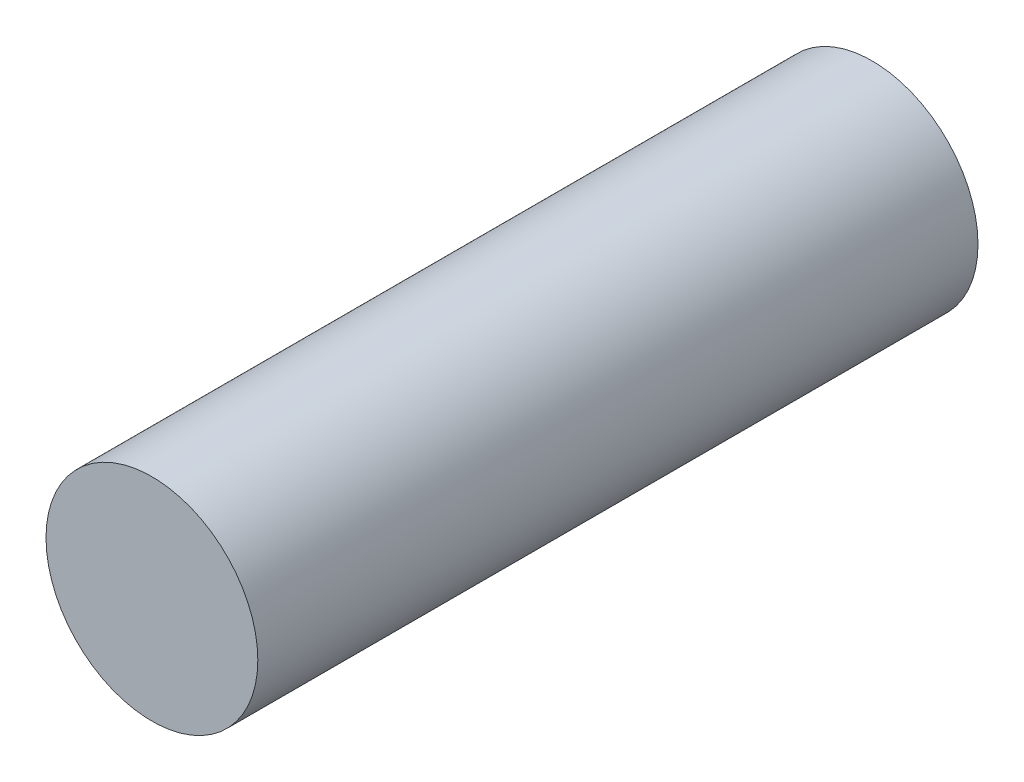
ISO-10303-21;
HEADER;
FILE_DESCRIPTION(('STEP AP214'),'2;1');
FILE_NAME('part.step','',(''),(''),'','','');
FILE_SCHEMA(('AUTOMOTIVE_DESIGN { 1 0 10303 214 1 1 1 1 }'));
ENDSEC;
DATA;
#1=APPLICATION_CONTEXT('core data for automotive mechanical design processes');
#2=APPLICATION_PROTOCOL_DEFINITION('international standard','automotive_design',2000,#1);
#3=PRODUCT_CONTEXT('',#1,'mechanical');
#4=PRODUCT('Part','Part','',(#3));
#5=PRODUCT_RELATED_PRODUCT_CATEGORY('part','',(#4));
#6=PRODUCT_DEFINITION_FORMATION('','',#4);
#7=PRODUCT_DEFINITION_CONTEXT('part definition',#1,'design');
#8=PRODUCT_DEFINITION('design','',#6,#7);
#9=PRODUCT_DEFINITION_SHAPE('','',#8);
#10=(LENGTH_UNIT() NAMED_UNIT(*) SI_UNIT(.MILLI.,.METRE.));
#11=(NAMED_UNIT(*) PLANE_ANGLE_UNIT() SI_UNIT($,.RADIAN.));
#12=(NAMED_UNIT(*) SI_UNIT($,.STERADIAN.) SOLID_ANGLE_UNIT());
#13=UNCERTAINTY_MEASURE_WITH_UNIT(LENGTH_MEASURE(1.E-05),#10,'distance_accuracy_value','');
#14=(GEOMETRIC_REPRESENTATION_CONTEXT(3) GLOBAL_UNCERTAINTY_ASSIGNED_CONTEXT((#13)) GLOBAL_UNIT_ASSIGNED_CONTEXT((#10,
#11,#12)) REPRESENTATION_CONTEXT('',''));
#15=CARTESIAN_POINT('',(0.,0.,0.));
#16=DIRECTION('',(0.,0.,1.));
#17=DIRECTION('',(1.,0.,0.));
#18=AXIS2_PLACEMENT_3D('',#15,#16,#17);
#19=CARTESIAN_POINT('',(0.,0.,34.));
#20=DIRECTION('',(0.,0.,-1.));
#21=DIRECTION('',(-1.,0.,0.));
#22=AXIS2_PLACEMENT_3D('',#19,#20,#21);
#23=CYLINDRICAL_SURFACE('',#22,5.);
#24=CARTESIAN_POINT('',(0.,0.,34.));
#25=DIRECTION('',(0.,0.,1.));
#26=DIRECTION('',(1.,0.,0.));
#27=AXIS2_PLACEMENT_3D('',#24,#25,#26);
#28=CIRCLE('',#27,5.);
#29=CARTESIAN_POINT('',(5.,0.,34.));
#30=VERTEX_POINT('',#29);
#31=EDGE_CURVE('E10',#30,#30,#28,.T.);
#32=ORIENTED_EDGE('',*,*,#31,.F.);
#33=EDGE_LOOP('',(#32));
#34=FACE_BOUND('',#33,.T.);
#35=CARTESIAN_POINT('',(0.,0.,0.));
#36=DIRECTION('',(0.,0.,1.));
#37=DIRECTION('',(1.,0.,0.));
#38=AXIS2_PLACEMENT_3D('',#35,#36,#37);
#39=CIRCLE('',#38,5.);
#40=CARTESIAN_POINT('',(5.,0.,0.));
#41=VERTEX_POINT('',#40);
#42=EDGE_CURVE('E50',#41,#41,#39,.T.);
#43=ORIENTED_EDGE('',*,*,#42,.T.);
#44=EDGE_LOOP('',(#43));
#45=FACE_BOUND('',#44,.T.);
#46=ADVANCED_FACE('F47',(#34,#45),#23,.T.);
#47=CARTESIAN_POINT('',(0.,0.,34.));
#48=DIRECTION('',(0.,0.,1.));
#49=DIRECTION('',(1.,0.,0.));
#50=AXIS2_PLACEMENT_3D('',#47,#48,#49);
#51=PLANE('',#50);
#52=ORIENTED_EDGE('',*,*,#31,.T.);
#53=EDGE_LOOP('',(#52));
#54=FACE_BOUND('',#53,.T.);
#55=ADVANCED_FACE('F64',(#54),#51,.T.);
#56=CARTESIAN_POINT('',(0.,0.,0.));
#57=DIRECTION('',(0.,0.,1.));
#58=DIRECTION('',(1.,0.,0.));
#59=AXIS2_PLACEMENT_3D('',#56,#57,#58);
#60=PLANE('',#59);
#61=ORIENTED_EDGE('',*,*,#42,.F.);
#62=EDGE_LOOP('',(#61));
#63=FACE_BOUND('',#62,.T.);
#64=ADVANCED_FACE('F62',(#63),#60,.F.);
#65=CLOSED_SHELL('',(#46,#55,#64));
#66=MANIFOLD_SOLID_BREP('B2',#65);
#67=ADVANCED_BREP_SHAPE_REPRESENTATION('',(#18,#66),#14);
#68=SHAPE_DEFINITION_REPRESENTATION(#9,#67);
ENDSEC;
END-ISO-10303-21;
